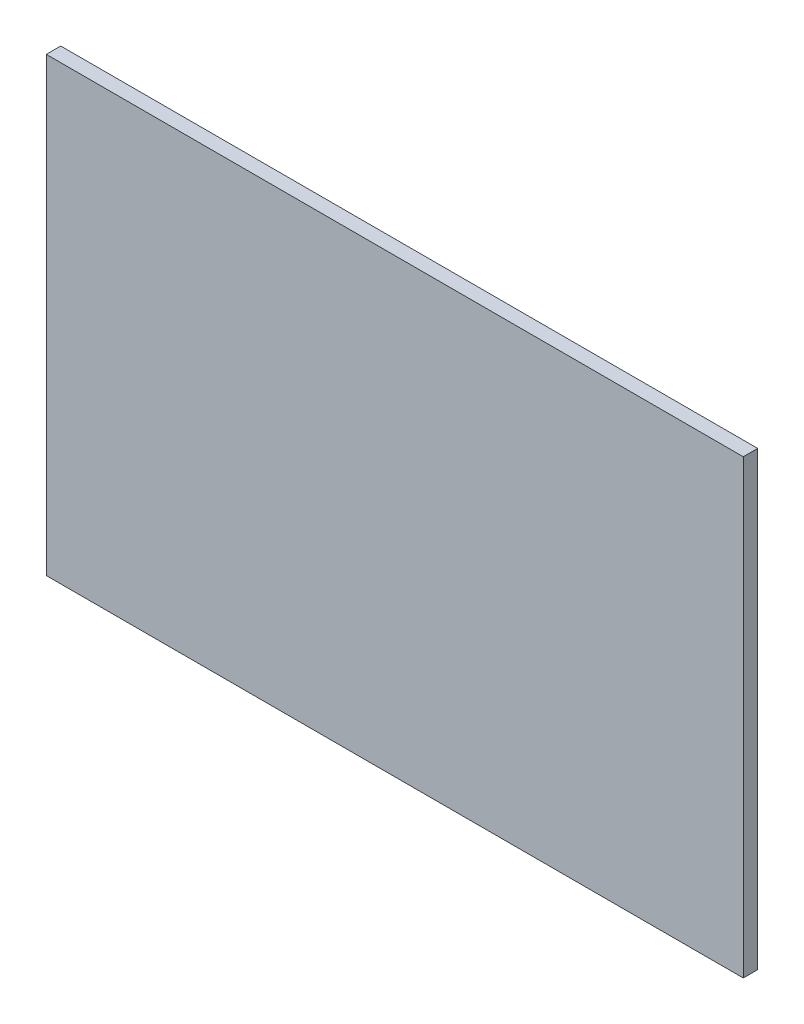
ISO-10303-21;
HEADER;
FILE_DESCRIPTION(('STEP AP214'),'2;1');
FILE_NAME('part.step','',(''),(''),'','','');
FILE_SCHEMA(('AUTOMOTIVE_DESIGN { 1 0 10303 214 1 1 1 1 }'));
ENDSEC;
DATA;
#1=APPLICATION_CONTEXT('core data for automotive mechanical design processes');
#2=APPLICATION_PROTOCOL_DEFINITION('international standard','automotive_design',2000,#1);
#3=PRODUCT_CONTEXT('',#1,'mechanical');
#4=PRODUCT('Part','Part','',(#3));
#5=PRODUCT_RELATED_PRODUCT_CATEGORY('part','',(#4));
#6=PRODUCT_DEFINITION_FORMATION('','',#4);
#7=PRODUCT_DEFINITION_CONTEXT('part definition',#1,'design');
#8=PRODUCT_DEFINITION('design','',#6,#7);
#9=PRODUCT_DEFINITION_SHAPE('','',#8);
#10=(LENGTH_UNIT() NAMED_UNIT(*) SI_UNIT(.MILLI.,.METRE.));
#11=(NAMED_UNIT(*) PLANE_ANGLE_UNIT() SI_UNIT($,.RADIAN.));
#12=(NAMED_UNIT(*) SI_UNIT($,.STERADIAN.) SOLID_ANGLE_UNIT());
#13=UNCERTAINTY_MEASURE_WITH_UNIT(LENGTH_MEASURE(1.E-05),#10,'distance_accuracy_value','');
#14=(GEOMETRIC_REPRESENTATION_CONTEXT(3) GLOBAL_UNCERTAINTY_ASSIGNED_CONTEXT((#13)) GLOBAL_UNIT_ASSIGNED_CONTEXT((#10,
#11,#12)) REPRESENTATION_CONTEXT('',''));
#15=CARTESIAN_POINT('',(0.,0.,0.));
#16=DIRECTION('',(0.,0.,1.));
#17=DIRECTION('',(1.,0.,0.));
#18=AXIS2_PLACEMENT_3D('',#15,#16,#17);
#19=CARTESIAN_POINT('',(0.,0.,80.));
#20=DIRECTION('',(1.,0.,0.));
#21=DIRECTION('',(0.,0.,-1.));
#22=AXIS2_PLACEMENT_3D('',#19,#20,#21);
#23=PLANE('',#22);
#24=DIRECTION('',(0.,-1.,0.));
#25=VECTOR('',#24,1.);
#26=CARTESIAN_POINT('',(0.,0.,0.));
#27=LINE('',#26,#25);
#28=CARTESIAN_POINT('',(0.,2500.,0.));
#29=VERTEX_POINT('',#28);
#30=CARTESIAN_POINT('',(0.,0.,0.));
#31=VERTEX_POINT('',#30);
#32=EDGE_CURVE('E96',#29,#31,#27,.T.);
#33=ORIENTED_EDGE('',*,*,#32,.T.);
#34=DIRECTION('',(0.,0.,-1.));
#35=VECTOR('',#34,1.);
#36=CARTESIAN_POINT('',(0.,0.,80.));
#37=LINE('',#36,#35);
#38=CARTESIAN_POINT('',(0.,0.,80.));
#39=VERTEX_POINT('',#38);
#40=EDGE_CURVE('E11',#39,#31,#37,.T.);
#41=ORIENTED_EDGE('',*,*,#40,.F.);
#42=DIRECTION('',(0.,-1.,0.));
#43=VECTOR('',#42,1.);
#44=CARTESIAN_POINT('',(0.,0.,80.));
#45=LINE('',#44,#43);
#46=CARTESIAN_POINT('',(0.,2500.,80.));
#47=VERTEX_POINT('',#46);
#48=EDGE_CURVE('E84',#47,#39,#45,.T.);
#49=ORIENTED_EDGE('',*,*,#48,.F.);
#50=DIRECTION('',(0.,0.,-1.));
#51=VECTOR('',#50,1.);
#52=CARTESIAN_POINT('',(0.,2500.,80.));
#53=LINE('',#52,#51);
#54=EDGE_CURVE('E92',#47,#29,#53,.T.);
#55=ORIENTED_EDGE('',*,*,#54,.T.);
#56=EDGE_LOOP('',(#33,#41,#49,#55));
#57=FACE_BOUND('',#56,.T.);
#58=ADVANCED_FACE('F33',(#57),#23,.F.);
#59=CARTESIAN_POINT('',(0.,0.,80.));
#60=DIRECTION('',(0.,1.,0.));
#61=DIRECTION('',(0.,0.,1.));
#62=AXIS2_PLACEMENT_3D('',#59,#60,#61);
#63=PLANE('',#62);
#64=DIRECTION('',(1.,0.,0.));
#65=VECTOR('',#64,1.);
#66=CARTESIAN_POINT('',(0.,0.,0.));
#67=LINE('',#66,#65);
#68=CARTESIAN_POINT('',(3860.,0.,0.));
#69=VERTEX_POINT('',#68);
#70=EDGE_CURVE('E88',#31,#69,#67,.T.);
#71=ORIENTED_EDGE('',*,*,#70,.T.);
#72=DIRECTION('',(0.,0.,-1.));
#73=VECTOR('',#72,1.);
#74=CARTESIAN_POINT('',(3860.,0.,80.));
#75=LINE('',#74,#73);
#76=CARTESIAN_POINT('',(3860.,0.,80.));
#77=VERTEX_POINT('',#76);
#78=EDGE_CURVE('E41',#77,#69,#75,.T.);
#79=ORIENTED_EDGE('',*,*,#78,.F.);
#80=DIRECTION('',(1.,0.,0.));
#81=VECTOR('',#80,1.);
#82=CARTESIAN_POINT('',(0.,0.,80.));
#83=LINE('',#82,#81);
#84=EDGE_CURVE('E79',#39,#77,#83,.T.);
#85=ORIENTED_EDGE('',*,*,#84,.F.);
#86=ORIENTED_EDGE('',*,*,#40,.T.);
#87=EDGE_LOOP('',(#71,#79,#85,#86));
#88=FACE_BOUND('',#87,.T.);
#89=ADVANCED_FACE('F87',(#88),#63,.F.);
#90=CARTESIAN_POINT('',(3860.,0.,80.));
#91=DIRECTION('',(-1.,0.,0.));
#92=DIRECTION('',(0.,0.,1.));
#93=AXIS2_PLACEMENT_3D('',#90,#91,#92);
#94=PLANE('',#93);
#95=DIRECTION('',(0.,1.,0.));
#96=VECTOR('',#95,1.);
#97=CARTESIAN_POINT('',(3860.,0.,0.));
#98=LINE('',#97,#96);
#99=CARTESIAN_POINT('',(3860.,2500.,0.));
#100=VERTEX_POINT('',#99);
#101=EDGE_CURVE('E66',#69,#100,#98,.T.);
#102=ORIENTED_EDGE('',*,*,#101,.T.);
#103=DIRECTION('',(0.,0.,-1.));
#104=VECTOR('',#103,1.);
#105=CARTESIAN_POINT('',(3860.,2500.,80.));
#106=LINE('',#105,#104);
#107=CARTESIAN_POINT('',(3860.,2500.,80.));
#108=VERTEX_POINT('',#107);
#109=EDGE_CURVE('E89',#108,#100,#106,.T.);
#110=ORIENTED_EDGE('',*,*,#109,.F.);
#111=DIRECTION('',(0.,1.,0.));
#112=VECTOR('',#111,1.);
#113=CARTESIAN_POINT('',(3860.,0.,80.));
#114=LINE('',#113,#112);
#115=EDGE_CURVE('E82',#77,#108,#114,.T.);
#116=ORIENTED_EDGE('',*,*,#115,.F.);
#117=ORIENTED_EDGE('',*,*,#78,.T.);
#118=EDGE_LOOP('',(#102,#110,#116,#117));
#119=FACE_BOUND('',#118,.T.);
#120=ADVANCED_FACE('F90',(#119),#94,.F.);
#121=CARTESIAN_POINT('',(0.,2500.,80.));
#122=DIRECTION('',(0.,-1.,0.));
#123=DIRECTION('',(0.,0.,-1.));
#124=AXIS2_PLACEMENT_3D('',#121,#122,#123);
#125=PLANE('',#124);
#126=DIRECTION('',(-1.,0.,0.));
#127=VECTOR('',#126,1.);
#128=CARTESIAN_POINT('',(0.,2500.,0.));
#129=LINE('',#128,#127);
#130=EDGE_CURVE('E72',#100,#29,#129,.T.);
#131=ORIENTED_EDGE('',*,*,#130,.T.);
#132=ORIENTED_EDGE('',*,*,#54,.F.);
#133=DIRECTION('',(-1.,0.,0.));
#134=VECTOR('',#133,1.);
#135=CARTESIAN_POINT('',(0.,2500.,80.));
#136=LINE('',#135,#134);
#137=EDGE_CURVE('E49',#108,#47,#136,.T.);
#138=ORIENTED_EDGE('',*,*,#137,.F.);
#139=ORIENTED_EDGE('',*,*,#109,.T.);
#140=EDGE_LOOP('',(#131,#132,#138,#139));
#141=FACE_BOUND('',#140,.T.);
#142=ADVANCED_FACE('F103',(#141),#125,.F.);
#143=CARTESIAN_POINT('',(0.,0.,80.));
#144=DIRECTION('',(0.,0.,-1.));
#145=DIRECTION('',(-1.,0.,0.));
#146=AXIS2_PLACEMENT_3D('',#143,#144,#145);
#147=PLANE('',#146);
#148=ORIENTED_EDGE('',*,*,#48,.T.);
#149=ORIENTED_EDGE('',*,*,#84,.T.);
#150=ORIENTED_EDGE('',*,*,#115,.T.);
#151=ORIENTED_EDGE('',*,*,#137,.T.);
#152=EDGE_LOOP('',(#148,#149,#150,#151));
#153=FACE_BOUND('',#152,.T.);
#154=ADVANCED_FACE('F80',(#153),#147,.F.);
#155=CARTESIAN_POINT('',(0.,0.,0.));
#156=DIRECTION('',(0.,0.,-1.));
#157=DIRECTION('',(-1.,0.,0.));
#158=AXIS2_PLACEMENT_3D('',#155,#156,#157);
#159=PLANE('',#158);
#160=ORIENTED_EDGE('',*,*,#32,.F.);
#161=ORIENTED_EDGE('',*,*,#130,.F.);
#162=ORIENTED_EDGE('',*,*,#101,.F.);
#163=ORIENTED_EDGE('',*,*,#70,.F.);
#164=EDGE_LOOP('',(#160,#161,#162,#163));
#165=FACE_BOUND('',#164,.T.);
#166=ADVANCED_FACE('F106',(#165),#159,.T.);
#167=CLOSED_SHELL('',(#58,#89,#120,#142,#154,#166));
#168=MANIFOLD_SOLID_BREP('B2',#167);
#169=ADVANCED_BREP_SHAPE_REPRESENTATION('',(#18,#168),#14);
#170=SHAPE_DEFINITION_REPRESENTATION(#9,#169);
ENDSEC;
END-ISO-10303-21;
